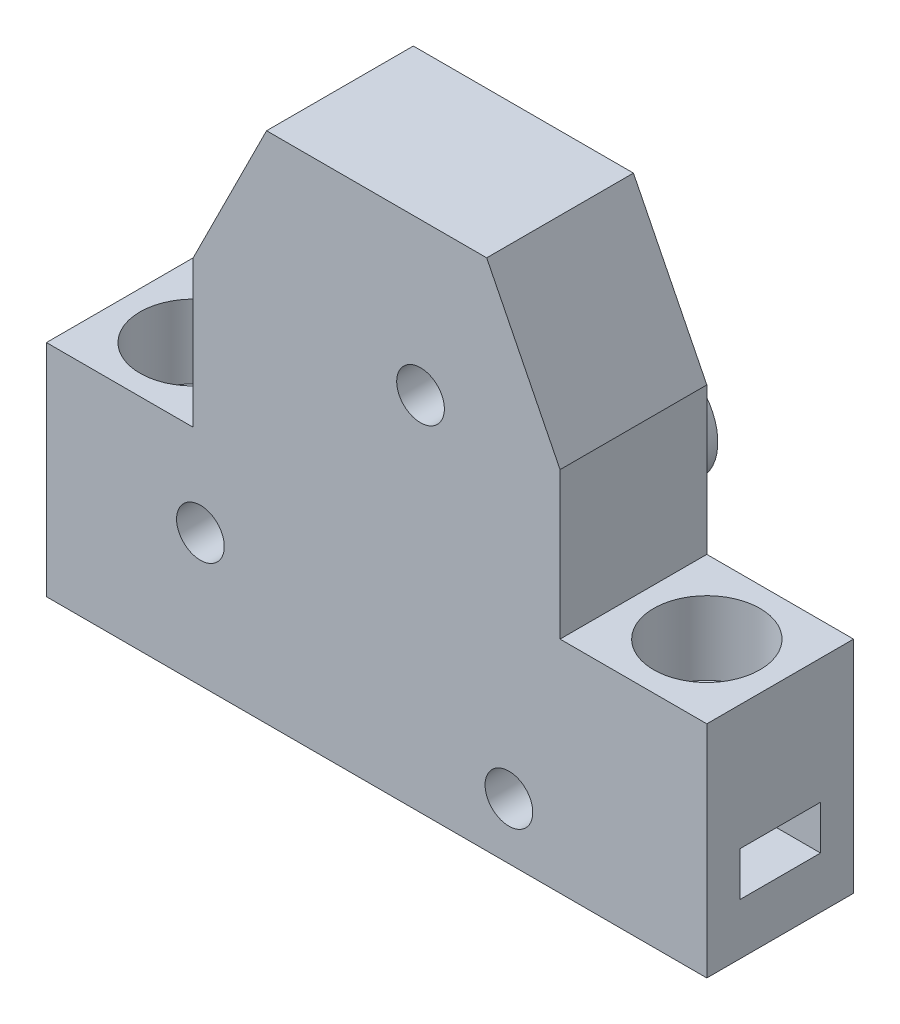
ISO-10303-21;
HEADER;
FILE_DESCRIPTION(('STEP AP214'),'2;1');
FILE_NAME('part.step','',(''),(''),'','','');
FILE_SCHEMA(('AUTOMOTIVE_DESIGN { 1 0 10303 214 1 1 1 1 }'));
ENDSEC;
DATA;
#1=APPLICATION_CONTEXT('core data for automotive mechanical design processes');
#2=APPLICATION_PROTOCOL_DEFINITION('international standard','automotive_design',2000,#1);
#3=PRODUCT_CONTEXT('',#1,'mechanical');
#4=PRODUCT('Part','Part','',(#3));
#5=PRODUCT_RELATED_PRODUCT_CATEGORY('part','',(#4));
#6=PRODUCT_DEFINITION_FORMATION('','',#4);
#7=PRODUCT_DEFINITION_CONTEXT('part definition',#1,'design');
#8=PRODUCT_DEFINITION('design','',#6,#7);
#9=PRODUCT_DEFINITION_SHAPE('','',#8);
#10=(LENGTH_UNIT() NAMED_UNIT(*) SI_UNIT(.MILLI.,.METRE.));
#11=(NAMED_UNIT(*) PLANE_ANGLE_UNIT() SI_UNIT($,.RADIAN.));
#12=(NAMED_UNIT(*) SI_UNIT($,.STERADIAN.) SOLID_ANGLE_UNIT());
#13=UNCERTAINTY_MEASURE_WITH_UNIT(LENGTH_MEASURE(1.E-05),#10,'distance_accuracy_value','');
#14=(GEOMETRIC_REPRESENTATION_CONTEXT(3) GLOBAL_UNCERTAINTY_ASSIGNED_CONTEXT((#13)) GLOBAL_UNIT_ASSIGNED_CONTEXT((#10,
#11,#12)) REPRESENTATION_CONTEXT('',''));
#15=CARTESIAN_POINT('',(0.,0.,0.));
#16=DIRECTION('',(0.,0.,1.));
#17=DIRECTION('',(1.,0.,0.));
#18=AXIS2_PLACEMENT_3D('',#15,#16,#17);
#19=CARTESIAN_POINT('',(45.0000000000002,-24.9999999999998,10.));
#20=DIRECTION('',(-1.,0.,0.));
#21=DIRECTION('',(0.,-1.,0.));
#22=AXIS2_PLACEMENT_3D('',#19,#20,#21);
#23=PLANE('',#22);
#24=DIRECTION('',(0.,1.,0.));
#25=VECTOR('',#24,1.);
#26=CARTESIAN_POINT('',(45.0000000000002,-24.9999999999998,-10.));
#27=LINE('',#26,#25);
#28=CARTESIAN_POINT('',(45.0000000000002,-24.9999999999998,-10.));
#29=VERTEX_POINT('',#28);
#30=CARTESIAN_POINT('',(45.,5.00000000000045,-10.));
#31=VERTEX_POINT('',#30);
#32=EDGE_CURVE('E295',#29,#31,#27,.T.);
#33=ORIENTED_EDGE('',*,*,#32,.T.);
#34=DIRECTION('',(0.,0.,-1.));
#35=VECTOR('',#34,1.);
#36=CARTESIAN_POINT('',(45.,5.00000000000045,10.));
#37=LINE('',#36,#35);
#38=CARTESIAN_POINT('',(45.,5.00000000000045,10.));
#39=VERTEX_POINT('',#38);
#40=EDGE_CURVE('E320',#39,#31,#37,.T.);
#41=ORIENTED_EDGE('',*,*,#40,.F.);
#42=DIRECTION('',(0.,1.,0.));
#43=VECTOR('',#42,1.);
#44=CARTESIAN_POINT('',(45.0000000000002,-24.9999999999998,10.));
#45=LINE('',#44,#43);
#46=CARTESIAN_POINT('',(45.0000000000002,-24.9999999999998,10.));
#47=VERTEX_POINT('',#46);
#48=EDGE_CURVE('E273',#47,#39,#45,.T.);
#49=ORIENTED_EDGE('',*,*,#48,.F.);
#50=DIRECTION('',(0.,0.,-1.));
#51=VECTOR('',#50,1.);
#52=CARTESIAN_POINT('',(45.0000000000002,-24.9999999999998,10.));
#53=LINE('',#52,#51);
#54=EDGE_CURVE('E323',#47,#29,#53,.T.);
#55=ORIENTED_EDGE('',*,*,#54,.T.);
#56=EDGE_LOOP('',(#33,#41,#49,#55));
#57=FACE_BOUND('',#56,.T.);
#58=DIRECTION('',(0.,-1.,0.));
#59=VECTOR('',#58,1.);
#60=CARTESIAN_POINT('',(45.,-18.,-5.5));
#61=LINE('',#60,#59);
#62=CARTESIAN_POINT('',(45.0000000000001,-12.,-5.5));
#63=VERTEX_POINT('',#62);
#64=CARTESIAN_POINT('',(45.,-18.,-5.5));
#65=VERTEX_POINT('',#64);
#66=EDGE_CURVE('E51',#63,#65,#61,.T.);
#67=ORIENTED_EDGE('',*,*,#66,.T.);
#68=DIRECTION('',(0.,0.,1.));
#69=VECTOR('',#68,1.);
#70=CARTESIAN_POINT('',(45.,-18.,5.5));
#71=LINE('',#70,#69);
#72=CARTESIAN_POINT('',(45.,-18.,5.5));
#73=VERTEX_POINT('',#72);
#74=EDGE_CURVE('E181',#65,#73,#71,.T.);
#75=ORIENTED_EDGE('',*,*,#74,.T.);
#76=DIRECTION('',(0.,1.,0.));
#77=VECTOR('',#76,1.);
#78=CARTESIAN_POINT('',(45.,-18.,5.5));
#79=LINE('',#78,#77);
#80=CARTESIAN_POINT('',(45.,-12.,5.5));
#81=VERTEX_POINT('',#80);
#82=EDGE_CURVE('E184',#73,#81,#79,.T.);
#83=ORIENTED_EDGE('',*,*,#82,.T.);
#84=DIRECTION('',(0.,0.,-1.));
#85=VECTOR('',#84,1.);
#86=CARTESIAN_POINT('',(45.,-12.,5.5));
#87=LINE('',#86,#85);
#88=EDGE_CURVE('E193',#81,#63,#87,.T.);
#89=ORIENTED_EDGE('',*,*,#88,.T.);
#90=EDGE_LOOP('',(#67,#75,#83,#89));
#91=FACE_BOUND('',#90,.T.);
#92=ADVANCED_FACE('F35',(#57,#91),#23,.F.);
#93=CARTESIAN_POINT('',(-25.,5.,10.));
#94=DIRECTION('',(1.,0.,0.));
#95=DIRECTION('',(0.,0.,-1.));
#96=AXIS2_PLACEMENT_3D('',#93,#94,#95);
#97=PLANE('',#96);
#98=DIRECTION('',(0.,-1.,0.));
#99=VECTOR('',#98,1.);
#100=CARTESIAN_POINT('',(-25.,5.,-10.));
#101=LINE('',#100,#99);
#102=CARTESIAN_POINT('',(-25.,25.,-10.));
#103=VERTEX_POINT('',#102);
#104=CARTESIAN_POINT('',(-25.,5.,-10.));
#105=VERTEX_POINT('',#104);
#106=EDGE_CURVE('E262',#103,#105,#101,.T.);
#107=ORIENTED_EDGE('',*,*,#106,.T.);
#108=DIRECTION('',(0.,0.,-1.));
#109=VECTOR('',#108,1.);
#110=CARTESIAN_POINT('',(-25.,5.,10.));
#111=LINE('',#110,#109);
#112=CARTESIAN_POINT('',(-25.,5.,10.));
#113=VERTEX_POINT('',#112);
#114=EDGE_CURVE('E332',#113,#105,#111,.T.);
#115=ORIENTED_EDGE('',*,*,#114,.F.);
#116=DIRECTION('',(0.,-1.,0.));
#117=VECTOR('',#116,1.);
#118=CARTESIAN_POINT('',(-25.,5.,10.));
#119=LINE('',#118,#117);
#120=CARTESIAN_POINT('',(-25.,25.,10.));
#121=VERTEX_POINT('',#120);
#122=EDGE_CURVE('E263',#121,#113,#119,.T.);
#123=ORIENTED_EDGE('',*,*,#122,.F.);
#124=DIRECTION('',(0.,0.,-1.));
#125=VECTOR('',#124,1.);
#126=CARTESIAN_POINT('',(-25.,25.,10.));
#127=LINE('',#126,#125);
#128=EDGE_CURVE('E285',#121,#103,#127,.T.);
#129=ORIENTED_EDGE('',*,*,#128,.T.);
#130=EDGE_LOOP('',(#107,#115,#123,#129));
#131=FACE_BOUND('',#130,.T.);
#132=ADVANCED_FACE('F360',(#131),#97,.F.);
#133=CARTESIAN_POINT('',(-25.,5.,10.));
#134=DIRECTION('',(0.,-1.,0.));
#135=DIRECTION('',(1.,0.,0.));
#136=AXIS2_PLACEMENT_3D('',#133,#134,#135);
#137=PLANE('',#136);
#138=CARTESIAN_POINT('',(-35.,5.,0.));
#139=DIRECTION('',(0.,1.,0.));
#140=DIRECTION('',(-1.,0.,0.));
#141=AXIS2_PLACEMENT_3D('',#138,#139,#140);
#142=CIRCLE('',#141,7.25);
#143=CARTESIAN_POINT('',(-42.25,5.,0.));
#144=VERTEX_POINT('',#143);
#145=EDGE_CURVE('E239',#144,#144,#142,.T.);
#146=ORIENTED_EDGE('',*,*,#145,.F.);
#147=EDGE_LOOP('',(#146));
#148=FACE_BOUND('',#147,.T.);
#149=DIRECTION('',(-1.,0.,0.));
#150=VECTOR('',#149,1.);
#151=CARTESIAN_POINT('',(-25.,5.,-10.));
#152=LINE('',#151,#150);
#153=CARTESIAN_POINT('',(-45.,5.,-10.));
#154=VERTEX_POINT('',#153);
#155=EDGE_CURVE('E288',#105,#154,#152,.T.);
#156=ORIENTED_EDGE('',*,*,#155,.T.);
#157=DIRECTION('',(0.,0.,-1.));
#158=VECTOR('',#157,1.);
#159=CARTESIAN_POINT('',(-45.,5.,10.));
#160=LINE('',#159,#158);
#161=CARTESIAN_POINT('',(-45.,5.,10.));
#162=VERTEX_POINT('',#161);
#163=EDGE_CURVE('E329',#162,#154,#160,.T.);
#164=ORIENTED_EDGE('',*,*,#163,.F.);
#165=DIRECTION('',(-1.,0.,0.));
#166=VECTOR('',#165,1.);
#167=CARTESIAN_POINT('',(-25.,5.,10.));
#168=LINE('',#167,#166);
#169=EDGE_CURVE('E266',#113,#162,#168,.T.);
#170=ORIENTED_EDGE('',*,*,#169,.F.);
#171=ORIENTED_EDGE('',*,*,#114,.T.);
#172=EDGE_LOOP('',(#156,#164,#170,#171));
#173=FACE_BOUND('',#172,.T.);
#174=ADVANCED_FACE('F366',(#148,#173),#137,.F.);
#175=CARTESIAN_POINT('',(-45.,-25.,10.));
#176=DIRECTION('',(1.,0.,0.));
#177=DIRECTION('',(0.,0.,-1.));
#178=AXIS2_PLACEMENT_3D('',#175,#176,#177);
#179=PLANE('',#178);
#180=DIRECTION('',(0.,0.,1.));
#181=VECTOR('',#180,1.);
#182=CARTESIAN_POINT('',(-45.,-18.,5.5));
#183=LINE('',#182,#181);
#184=CARTESIAN_POINT('',(-45.,-18.,-5.5));
#185=VERTEX_POINT('',#184);
#186=CARTESIAN_POINT('',(-45.,-18.,5.5));
#187=VERTEX_POINT('',#186);
#188=EDGE_CURVE('E229',#185,#187,#183,.T.);
#189=ORIENTED_EDGE('',*,*,#188,.F.);
#190=DIRECTION('',(0.,-1.,0.));
#191=VECTOR('',#190,1.);
#192=CARTESIAN_POINT('',(-45.,-18.,-5.5));
#193=LINE('',#192,#191);
#194=CARTESIAN_POINT('',(-45.,-12.,-5.5));
#195=VERTEX_POINT('',#194);
#196=EDGE_CURVE('E59',#195,#185,#193,.T.);
#197=ORIENTED_EDGE('',*,*,#196,.F.);
#198=DIRECTION('',(0.,0.,-1.));
#199=VECTOR('',#198,1.);
#200=CARTESIAN_POINT('',(-45.,-12.,5.5));
#201=LINE('',#200,#199);
#202=CARTESIAN_POINT('',(-45.,-12.,5.5));
#203=VERTEX_POINT('',#202);
#204=EDGE_CURVE('E218',#203,#195,#201,.T.);
#205=ORIENTED_EDGE('',*,*,#204,.F.);
#206=DIRECTION('',(0.,1.,0.));
#207=VECTOR('',#206,1.);
#208=CARTESIAN_POINT('',(-45.,-18.,5.5));
#209=LINE('',#208,#207);
#210=EDGE_CURVE('E232',#187,#203,#209,.T.);
#211=ORIENTED_EDGE('',*,*,#210,.F.);
#212=EDGE_LOOP('',(#189,#197,#205,#211));
#213=FACE_BOUND('',#212,.T.);
#214=DIRECTION('',(0.,-1.,0.));
#215=VECTOR('',#214,1.);
#216=CARTESIAN_POINT('',(-45.,-25.,-10.));
#217=LINE('',#216,#215);
#218=CARTESIAN_POINT('',(-45.,-25.,-10.));
#219=VERTEX_POINT('',#218);
#220=EDGE_CURVE('E290',#154,#219,#217,.T.);
#221=ORIENTED_EDGE('',*,*,#220,.T.);
#222=DIRECTION('',(0.,0.,-1.));
#223=VECTOR('',#222,1.);
#224=CARTESIAN_POINT('',(-45.,-25.,10.));
#225=LINE('',#224,#223);
#226=CARTESIAN_POINT('',(-45.,-25.,10.));
#227=VERTEX_POINT('',#226);
#228=EDGE_CURVE('E326',#227,#219,#225,.T.);
#229=ORIENTED_EDGE('',*,*,#228,.F.);
#230=DIRECTION('',(0.,-1.,0.));
#231=VECTOR('',#230,1.);
#232=CARTESIAN_POINT('',(-45.,-25.,10.));
#233=LINE('',#232,#231);
#234=EDGE_CURVE('E269',#162,#227,#233,.T.);
#235=ORIENTED_EDGE('',*,*,#234,.F.);
#236=ORIENTED_EDGE('',*,*,#163,.T.);
#237=EDGE_LOOP('',(#221,#229,#235,#236));
#238=FACE_BOUND('',#237,.T.);
#239=ADVANCED_FACE('F376',(#213,#238),#179,.F.);
#240=CARTESIAN_POINT('',(25.,-25.,10.));
#241=DIRECTION('',(0.,1.,0.));
#242=DIRECTION('',(-1.,0.,0.));
#243=AXIS2_PLACEMENT_3D('',#240,#241,#242);
#244=PLANE('',#243);
#245=DIRECTION('',(1.,0.,0.));
#246=VECTOR('',#245,1.);
#247=CARTESIAN_POINT('',(25.,-25.,-10.));
#248=LINE('',#247,#246);
#249=EDGE_CURVE('E293',#219,#29,#248,.T.);
#250=ORIENTED_EDGE('',*,*,#249,.T.);
#251=ORIENTED_EDGE('',*,*,#54,.F.);
#252=DIRECTION('',(1.,0.,0.));
#253=VECTOR('',#252,1.);
#254=CARTESIAN_POINT('',(-25.,-25.,10.));
#255=LINE('',#254,#253);
#256=EDGE_CURVE('E271',#227,#47,#255,.T.);
#257=ORIENTED_EDGE('',*,*,#256,.F.);
#258=ORIENTED_EDGE('',*,*,#228,.T.);
#259=EDGE_LOOP('',(#250,#251,#257,#258));
#260=FACE_BOUND('',#259,.T.);
#261=ADVANCED_FACE('F373',(#260),#244,.F.);
#262=CARTESIAN_POINT('',(25.,5.,10.));
#263=DIRECTION('',(0.,-1.,0.));
#264=DIRECTION('',(1.,0.,0.));
#265=AXIS2_PLACEMENT_3D('',#262,#263,#264);
#266=PLANE('',#265);
#267=CARTESIAN_POINT('',(35.,5.,0.));
#268=DIRECTION('',(0.,-1.,0.));
#269=DIRECTION('',(1.,0.,0.));
#270=AXIS2_PLACEMENT_3D('',#267,#268,#269);
#271=CIRCLE('',#270,7.25);
#272=CARTESIAN_POINT('',(42.25,5.,0.));
#273=VERTEX_POINT('',#272);
#274=EDGE_CURVE('E199',#273,#273,#271,.T.);
#275=ORIENTED_EDGE('',*,*,#274,.T.);
#276=EDGE_LOOP('',(#275));
#277=FACE_BOUND('',#276,.T.);
#278=DIRECTION('',(-1.,0.,0.));
#279=VECTOR('',#278,1.);
#280=CARTESIAN_POINT('',(25.,5.,-10.));
#281=LINE('',#280,#279);
#282=CARTESIAN_POINT('',(25.,5.,-10.));
#283=VERTEX_POINT('',#282);
#284=EDGE_CURVE('E297',#31,#283,#281,.T.);
#285=ORIENTED_EDGE('',*,*,#284,.T.);
#286=DIRECTION('',(0.,0.,-1.));
#287=VECTOR('',#286,1.);
#288=CARTESIAN_POINT('',(25.,5.,10.));
#289=LINE('',#288,#287);
#290=CARTESIAN_POINT('',(25.,5.,10.));
#291=VERTEX_POINT('',#290);
#292=EDGE_CURVE('E317',#291,#283,#289,.T.);
#293=ORIENTED_EDGE('',*,*,#292,.F.);
#294=DIRECTION('',(-1.,0.,0.));
#295=VECTOR('',#294,1.);
#296=CARTESIAN_POINT('',(25.,5.,10.));
#297=LINE('',#296,#295);
#298=EDGE_CURVE('E275',#39,#291,#297,.T.);
#299=ORIENTED_EDGE('',*,*,#298,.F.);
#300=ORIENTED_EDGE('',*,*,#40,.T.);
#301=EDGE_LOOP('',(#285,#293,#299,#300));
#302=FACE_BOUND('',#301,.T.);
#303=ADVANCED_FACE('F371',(#277,#302),#266,.F.);
#304=CARTESIAN_POINT('',(25.,5.,10.));
#305=DIRECTION('',(-1.,0.,0.));
#306=DIRECTION('',(0.,-1.,0.));
#307=AXIS2_PLACEMENT_3D('',#304,#305,#306);
#308=PLANE('',#307);
#309=DIRECTION('',(0.,1.,0.));
#310=VECTOR('',#309,1.);
#311=CARTESIAN_POINT('',(25.,5.,-10.));
#312=LINE('',#311,#310);
#313=CARTESIAN_POINT('',(25.,25.,-10.));
#314=VERTEX_POINT('',#313);
#315=EDGE_CURVE('E299',#283,#314,#312,.T.);
#316=ORIENTED_EDGE('',*,*,#315,.T.);
#317=DIRECTION('',(0.,0.,-1.));
#318=VECTOR('',#317,1.);
#319=CARTESIAN_POINT('',(25.,25.,10.));
#320=LINE('',#319,#318);
#321=CARTESIAN_POINT('',(25.,25.,10.));
#322=VERTEX_POINT('',#321);
#323=EDGE_CURVE('E314',#322,#314,#320,.T.);
#324=ORIENTED_EDGE('',*,*,#323,.F.);
#325=DIRECTION('',(0.,1.,0.));
#326=VECTOR('',#325,1.);
#327=CARTESIAN_POINT('',(25.,5.,10.));
#328=LINE('',#327,#326);
#329=EDGE_CURVE('E277',#291,#322,#328,.T.);
#330=ORIENTED_EDGE('',*,*,#329,.F.);
#331=ORIENTED_EDGE('',*,*,#292,.T.);
#332=EDGE_LOOP('',(#316,#324,#330,#331));
#333=FACE_BOUND('',#332,.T.);
#334=ADVANCED_FACE('F425',(#333),#308,.F.);
#335=CARTESIAN_POINT('',(15.,45.,10.));
#336=DIRECTION('',(-0.894427190999916,-0.447213595499958,0.));
#337=DIRECTION('',(0.447213595499958,-0.894427190999916,0.));
#338=AXIS2_PLACEMENT_3D('',#335,#336,#337);
#339=PLANE('',#338);
#340=DIRECTION('',(-0.447213595499958,0.894427190999916,0.));
#341=VECTOR('',#340,1.);
#342=CARTESIAN_POINT('',(15.,45.,-10.));
#343=LINE('',#342,#341);
#344=CARTESIAN_POINT('',(15.,45.,-10.));
#345=VERTEX_POINT('',#344);
#346=EDGE_CURVE('E301',#314,#345,#343,.T.);
#347=ORIENTED_EDGE('',*,*,#346,.T.);
#348=DIRECTION('',(0.,0.,-1.));
#349=VECTOR('',#348,1.);
#350=CARTESIAN_POINT('',(15.,45.,10.));
#351=LINE('',#350,#349);
#352=CARTESIAN_POINT('',(15.,45.,10.));
#353=VERTEX_POINT('',#352);
#354=EDGE_CURVE('E311',#353,#345,#351,.T.);
#355=ORIENTED_EDGE('',*,*,#354,.F.);
#356=DIRECTION('',(-0.447213595499958,0.894427190999916,0.));
#357=VECTOR('',#356,1.);
#358=CARTESIAN_POINT('',(15.,45.,10.));
#359=LINE('',#358,#357);
#360=EDGE_CURVE('E279',#322,#353,#359,.T.);
#361=ORIENTED_EDGE('',*,*,#360,.F.);
#362=ORIENTED_EDGE('',*,*,#323,.T.);
#363=EDGE_LOOP('',(#347,#355,#361,#362));
#364=FACE_BOUND('',#363,.T.);
#365=ADVANCED_FACE('F421',(#364),#339,.F.);
#366=CARTESIAN_POINT('',(-15.,45.,10.));
#367=DIRECTION('',(0.,-1.,0.));
#368=DIRECTION('',(0.,0.,-1.));
#369=AXIS2_PLACEMENT_3D('',#366,#367,#368);
#370=PLANE('',#369);
#371=DIRECTION('',(-1.,0.,0.));
#372=VECTOR('',#371,1.);
#373=CARTESIAN_POINT('',(-15.,45.,-10.));
#374=LINE('',#373,#372);
#375=CARTESIAN_POINT('',(-15.,45.,-10.));
#376=VERTEX_POINT('',#375);
#377=EDGE_CURVE('E303',#345,#376,#374,.T.);
#378=ORIENTED_EDGE('',*,*,#377,.T.);
#379=DIRECTION('',(0.,0.,-1.));
#380=VECTOR('',#379,1.);
#381=CARTESIAN_POINT('',(-15.,45.,10.));
#382=LINE('',#381,#380);
#383=CARTESIAN_POINT('',(-15.,45.,10.));
#384=VERTEX_POINT('',#383);
#385=EDGE_CURVE('E308',#384,#376,#382,.T.);
#386=ORIENTED_EDGE('',*,*,#385,.F.);
#387=DIRECTION('',(-1.,0.,0.));
#388=VECTOR('',#387,1.);
#389=CARTESIAN_POINT('',(-15.,45.,10.));
#390=LINE('',#389,#388);
#391=EDGE_CURVE('E281',#353,#384,#390,.T.);
#392=ORIENTED_EDGE('',*,*,#391,.F.);
#393=ORIENTED_EDGE('',*,*,#354,.T.);
#394=EDGE_LOOP('',(#378,#386,#392,#393));
#395=FACE_BOUND('',#394,.T.);
#396=ADVANCED_FACE('F417',(#395),#370,.F.);
#397=CARTESIAN_POINT('',(-25.,25.,10.));
#398=DIRECTION('',(0.894427190999916,-0.447213595499958,0.));
#399=DIRECTION('',(0.447213595499958,0.894427190999916,0.));
#400=AXIS2_PLACEMENT_3D('',#397,#398,#399);
#401=PLANE('',#400);
#402=DIRECTION('',(-0.447213595499958,-0.894427190999916,0.));
#403=VECTOR('',#402,1.);
#404=CARTESIAN_POINT('',(-25.,25.,-10.));
#405=LINE('',#404,#403);
#406=EDGE_CURVE('E267',#376,#103,#405,.T.);
#407=ORIENTED_EDGE('',*,*,#406,.T.);
#408=ORIENTED_EDGE('',*,*,#128,.F.);
#409=DIRECTION('',(-0.447213595499958,-0.894427190999916,0.));
#410=VECTOR('',#409,1.);
#411=CARTESIAN_POINT('',(-25.,25.,10.));
#412=LINE('',#411,#410);
#413=EDGE_CURVE('E283',#384,#121,#412,.T.);
#414=ORIENTED_EDGE('',*,*,#413,.F.);
#415=ORIENTED_EDGE('',*,*,#385,.T.);
#416=EDGE_LOOP('',(#407,#408,#414,#415));
#417=FACE_BOUND('',#416,.T.);
#418=ADVANCED_FACE('F413',(#417),#401,.F.);
#419=CARTESIAN_POINT('',(0.,0.,10.));
#420=DIRECTION('',(0.,0.,-1.));
#421=DIRECTION('',(-1.,0.,0.));
#422=AXIS2_PLACEMENT_3D('',#419,#420,#421);
#423=PLANE('',#422);
#424=CARTESIAN_POINT('',(5.98239087996583,24.2736688483489,10.));
#425=DIRECTION('',(0.,0.,-1.));
#426=DIRECTION('',(-1.,0.,0.));
#427=AXIS2_PLACEMENT_3D('',#424,#425,#426);
#428=CIRCLE('',#427,3.25);
#429=CARTESIAN_POINT('',(2.73239087996583,24.2736688483489,10.));
#430=VERTEX_POINT('',#429);
#431=EDGE_CURVE('E697',#430,#430,#428,.T.);
#432=ORIENTED_EDGE('',*,*,#431,.T.);
#433=EDGE_LOOP('',(#432));
#434=FACE_BOUND('',#433,.T.);
#435=CARTESIAN_POINT('',(-24.012809305704,-6.95593194675573,10.));
#436=DIRECTION('',(0.,0.,-1.));
#437=DIRECTION('',(-1.,0.,0.));
#438=AXIS2_PLACEMENT_3D('',#435,#436,#437);
#439=CIRCLE('',#438,3.25);
#440=CARTESIAN_POINT('',(-27.262809305704,-6.95593194675573,10.));
#441=VERTEX_POINT('',#440);
#442=EDGE_CURVE('E701',#441,#441,#439,.T.);
#443=ORIENTED_EDGE('',*,*,#442,.T.);
#444=EDGE_LOOP('',(#443));
#445=FACE_BOUND('',#444,.T.);
#446=CARTESIAN_POINT('',(18.0304184257382,-17.3177369015932,10.));
#447=DIRECTION('',(0.,0.,-1.));
#448=DIRECTION('',(-1.,0.,0.));
#449=AXIS2_PLACEMENT_3D('',#446,#447,#448);
#450=CIRCLE('',#449,3.25);
#451=CARTESIAN_POINT('',(14.7804184257382,-17.3177369015932,10.));
#452=VERTEX_POINT('',#451);
#453=EDGE_CURVE('E710',#452,#452,#450,.T.);
#454=ORIENTED_EDGE('',*,*,#453,.T.);
#455=EDGE_LOOP('',(#454));
#456=FACE_BOUND('',#455,.T.);
#457=ORIENTED_EDGE('',*,*,#122,.T.);
#458=ORIENTED_EDGE('',*,*,#169,.T.);
#459=ORIENTED_EDGE('',*,*,#234,.T.);
#460=ORIENTED_EDGE('',*,*,#256,.T.);
#461=ORIENTED_EDGE('',*,*,#48,.T.);
#462=ORIENTED_EDGE('',*,*,#298,.T.);
#463=ORIENTED_EDGE('',*,*,#329,.T.);
#464=ORIENTED_EDGE('',*,*,#360,.T.);
#465=ORIENTED_EDGE('',*,*,#391,.T.);
#466=ORIENTED_EDGE('',*,*,#413,.T.);
#467=EDGE_LOOP('',(#457,#458,#459,#460,#461,#462,#463,#464,#465,#466));
#468=FACE_BOUND('',#467,.T.);
#469=ADVANCED_FACE('F404',(#434,#445,#456,#468),#423,.F.);
#470=CARTESIAN_POINT('',(0.,0.,-10.));
#471=DIRECTION('',(0.,0.,-1.));
#472=DIRECTION('',(-1.,0.,0.));
#473=AXIS2_PLACEMENT_3D('',#470,#471,#472);
#474=PLANE('',#473);
#475=CARTESIAN_POINT('',(5.98239087996583,24.2736688483489,-10.));
#476=DIRECTION('',(0.,0.,-1.));
#477=DIRECTION('',(-1.,0.,0.));
#478=AXIS2_PLACEMENT_3D('',#475,#476,#477);
#479=CIRCLE('',#478,3.25);
#480=CARTESIAN_POINT('',(2.73239087996583,24.2736688483489,-10.));
#481=VERTEX_POINT('',#480);
#482=EDGE_CURVE('E700',#481,#481,#479,.T.);
#483=ORIENTED_EDGE('',*,*,#482,.F.);
#484=EDGE_LOOP('',(#483));
#485=FACE_BOUND('',#484,.T.);
#486=CARTESIAN_POINT('',(-24.012809305704,-6.95593194675573,-10.));
#487=DIRECTION('',(0.,0.,-1.));
#488=DIRECTION('',(-1.,0.,0.));
#489=AXIS2_PLACEMENT_3D('',#486,#487,#488);
#490=CIRCLE('',#489,3.25);
#491=CARTESIAN_POINT('',(-27.262809305704,-6.95593194675573,-10.));
#492=VERTEX_POINT('',#491);
#493=EDGE_CURVE('E705',#492,#492,#490,.T.);
#494=ORIENTED_EDGE('',*,*,#493,.F.);
#495=EDGE_LOOP('',(#494));
#496=FACE_BOUND('',#495,.T.);
#497=CARTESIAN_POINT('',(18.0304184257382,-17.3177369015932,-10.));
#498=DIRECTION('',(0.,0.,-1.));
#499=DIRECTION('',(-1.,0.,0.));
#500=AXIS2_PLACEMENT_3D('',#497,#498,#499);
#501=CIRCLE('',#500,3.25);
#502=CARTESIAN_POINT('',(14.7804184257382,-17.3177369015932,-10.));
#503=VERTEX_POINT('',#502);
#504=EDGE_CURVE('E712',#503,#503,#501,.T.);
#505=ORIENTED_EDGE('',*,*,#504,.F.);
#506=EDGE_LOOP('',(#505));
#507=FACE_BOUND('',#506,.T.);
#508=CARTESIAN_POINT('',(0.,0.,-10.));
#509=DIRECTION('',(0.,0.,-1.));
#510=DIRECTION('',(-1.,0.,0.));
#511=AXIS2_PLACEMENT_3D('',#508,#509,#510);
#512=CIRCLE('',#511,13.5);
#513=CARTESIAN_POINT('',(-13.5,0.,-10.));
#514=VERTEX_POINT('',#513);
#515=EDGE_CURVE('E11',#514,#514,#512,.F.);
#516=ORIENTED_EDGE('',*,*,#515,.T.);
#517=EDGE_LOOP('',(#516));
#518=FACE_BOUND('',#517,.T.);
#519=ORIENTED_EDGE('',*,*,#106,.F.);
#520=ORIENTED_EDGE('',*,*,#406,.F.);
#521=ORIENTED_EDGE('',*,*,#377,.F.);
#522=ORIENTED_EDGE('',*,*,#346,.F.);
#523=ORIENTED_EDGE('',*,*,#315,.F.);
#524=ORIENTED_EDGE('',*,*,#284,.F.);
#525=ORIENTED_EDGE('',*,*,#32,.F.);
#526=ORIENTED_EDGE('',*,*,#249,.F.);
#527=ORIENTED_EDGE('',*,*,#220,.F.);
#528=ORIENTED_EDGE('',*,*,#155,.F.);
#529=EDGE_LOOP('',(#519,#520,#521,#522,#523,#524,#525,#526,#527,#528));
#530=FACE_BOUND('',#529,.T.);
#531=ADVANCED_FACE('F395',(#485,#496,#507,#518,#530),#474,.T.);
#532=CARTESIAN_POINT('',(0.,0.,-25.));
#533=DIRECTION('',(0.,0.,1.));
#534=DIRECTION('',(1.,0.,0.));
#535=AXIS2_PLACEMENT_3D('',#532,#533,#534);
#536=CYLINDRICAL_SURFACE('',#535,7.5);
#537=CARTESIAN_POINT('',(0.,0.,-16.));
#538=DIRECTION('',(0.,0.,-1.));
#539=DIRECTION('',(-1.,0.,0.));
#540=AXIS2_PLACEMENT_3D('',#537,#538,#539);
#541=CIRCLE('',#540,7.5);
#542=CARTESIAN_POINT('',(-7.5,0.,-16.));
#543=VERTEX_POINT('',#542);
#544=EDGE_CURVE('E44',#543,#543,#541,.T.);
#545=ORIENTED_EDGE('',*,*,#544,.T.);
#546=EDGE_LOOP('',(#545));
#547=FACE_BOUND('',#546,.T.);
#548=CARTESIAN_POINT('',(0.,0.,-29.));
#549=DIRECTION('',(0.,0.,-1.));
#550=DIRECTION('',(-1.,0.,0.));
#551=AXIS2_PLACEMENT_3D('',#548,#549,#550);
#552=CIRCLE('',#551,7.5);
#553=CARTESIAN_POINT('',(-7.5,0.,-29.));
#554=VERTEX_POINT('',#553);
#555=EDGE_CURVE('E259',#554,#554,#552,.T.);
#556=ORIENTED_EDGE('',*,*,#555,.F.);
#557=EDGE_LOOP('',(#556));
#558=FACE_BOUND('',#557,.T.);
#559=ADVANCED_FACE('F341',(#547,#558),#536,.T.);
#560=CARTESIAN_POINT('',(0.,0.,-29.));
#561=DIRECTION('',(0.,0.,-1.));
#562=DIRECTION('',(-1.,0.,0.));
#563=AXIS2_PLACEMENT_3D('',#560,#561,#562);
#564=PLANE('',#563);
#565=ORIENTED_EDGE('',*,*,#555,.T.);
#566=EDGE_LOOP('',(#565));
#567=FACE_BOUND('',#566,.T.);
#568=CARTESIAN_POINT('',(0.,0.,-29.));
#569=DIRECTION('',(0.,0.,-1.));
#570=DIRECTION('',(-1.,0.,0.));
#571=AXIS2_PLACEMENT_3D('',#568,#569,#570);
#572=CIRCLE('',#571,4.7);
#573=CARTESIAN_POINT('',(-4.7,0.,-29.));
#574=VERTEX_POINT('',#573);
#575=EDGE_CURVE('E254',#574,#574,#572,.T.);
#576=ORIENTED_EDGE('',*,*,#575,.F.);
#577=EDGE_LOOP('',(#576));
#578=FACE_BOUND('',#577,.T.);
#579=ADVANCED_FACE('F480',(#567,#578),#564,.T.);
#580=CARTESIAN_POINT('',(0.,0.,-29.));
#581=DIRECTION('',(0.,0.,1.));
#582=DIRECTION('',(1.,0.,0.));
#583=AXIS2_PLACEMENT_3D('',#580,#581,#582);
#584=CYLINDRICAL_SURFACE('',#583,4.7);
#585=ORIENTED_EDGE('',*,*,#575,.T.);
#586=EDGE_LOOP('',(#585));
#587=FACE_BOUND('',#586,.T.);
#588=CARTESIAN_POINT('',(0.,0.,-25.));
#589=DIRECTION('',(0.,0.,-1.));
#590=DIRECTION('',(-1.,0.,0.));
#591=AXIS2_PLACEMENT_3D('',#588,#589,#590);
#592=CIRCLE('',#591,4.7);
#593=CARTESIAN_POINT('',(-4.7,0.,-25.));
#594=VERTEX_POINT('',#593);
#595=EDGE_CURVE('E335',#594,#594,#592,.F.);
#596=ORIENTED_EDGE('',*,*,#595,.T.);
#597=EDGE_LOOP('',(#596));
#598=FACE_BOUND('',#597,.T.);
#599=ADVANCED_FACE('F477',(#587,#598),#584,.F.);
#600=CARTESIAN_POINT('',(0.,0.,-25.));
#601=DIRECTION('',(0.,0.,-1.));
#602=DIRECTION('',(-1.,0.,0.));
#603=AXIS2_PLACEMENT_3D('',#600,#601,#602);
#604=PLANE('',#603);
#605=CARTESIAN_POINT('',(0.,0.,-25.));
#606=DIRECTION('',(0.,0.,-1.));
#607=DIRECTION('',(-1.,0.,0.));
#608=AXIS2_PLACEMENT_3D('',#605,#606,#607);
#609=CIRCLE('',#608,2.);
#610=CARTESIAN_POINT('',(-2.,0.,-25.));
#611=VERTEX_POINT('',#610);
#612=EDGE_CURVE('E248',#611,#611,#609,.T.);
#613=ORIENTED_EDGE('',*,*,#612,.F.);
#614=EDGE_LOOP('',(#613));
#615=FACE_BOUND('',#614,.T.);
#616=ORIENTED_EDGE('',*,*,#595,.F.);
#617=EDGE_LOOP('',(#616));
#618=FACE_BOUND('',#617,.T.);
#619=ADVANCED_FACE('F475',(#615,#618),#604,.T.);
#620=CARTESIAN_POINT('',(0.,0.,-22.));
#621=DIRECTION('',(0.,0.,-1.));
#622=DIRECTION('',(-1.,0.,0.));
#623=AXIS2_PLACEMENT_3D('',#620,#621,#622);
#624=CYLINDRICAL_SURFACE('',#623,2.);
#625=CARTESIAN_POINT('',(0.,0.,-22.));
#626=DIRECTION('',(0.,0.,-1.));
#627=DIRECTION('',(-1.,0.,0.));
#628=AXIS2_PLACEMENT_3D('',#625,#626,#627);
#629=CIRCLE('',#628,2.);
#630=CARTESIAN_POINT('',(-2.,0.,-22.));
#631=VERTEX_POINT('',#630);
#632=EDGE_CURVE('E251',#631,#631,#629,.T.);
#633=ORIENTED_EDGE('',*,*,#632,.F.);
#634=EDGE_LOOP('',(#633));
#635=FACE_BOUND('',#634,.T.);
#636=ORIENTED_EDGE('',*,*,#612,.T.);
#637=EDGE_LOOP('',(#636));
#638=FACE_BOUND('',#637,.T.);
#639=ADVANCED_FACE('F355',(#635,#638),#624,.F.);
#640=CARTESIAN_POINT('',(0.,0.,-22.));
#641=DIRECTION('',(0.,0.,-1.));
#642=DIRECTION('',(-1.,0.,0.));
#643=AXIS2_PLACEMENT_3D('',#640,#641,#642);
#644=PLANE('',#643);
#645=ORIENTED_EDGE('',*,*,#632,.T.);
#646=EDGE_LOOP('',(#645));
#647=FACE_BOUND('',#646,.T.);
#648=ADVANCED_FACE('F346',(#647),#644,.T.);
#649=CARTESIAN_POINT('',(0.,0.,-16.));
#650=DIRECTION('',(0.,0.,-1.));
#651=DIRECTION('',(-1.,0.,0.));
#652=AXIS2_PLACEMENT_3D('',#649,#650,#651);
#653=TOROIDAL_SURFACE('',#652,13.5,6.);
#654=ORIENTED_EDGE('',*,*,#515,.F.);
#655=EDGE_LOOP('',(#654));
#656=FACE_BOUND('',#655,.T.);
#657=ORIENTED_EDGE('',*,*,#544,.F.);
#658=EDGE_LOOP('',(#657));
#659=FACE_BOUND('',#658,.T.);
#660=ADVANCED_FACE('F37',(#656,#659),#653,.F.);
#661=CARTESIAN_POINT('',(-35.,-5.,0.));
#662=DIRECTION('',(0.,1.,0.));
#663=DIRECTION('',(-1.,0.,0.));
#664=AXIS2_PLACEMENT_3D('',#661,#662,#663);
#665=CYLINDRICAL_SURFACE('',#664,7.25);
#666=CARTESIAN_POINT('',(-35.,-5.,0.));
#667=DIRECTION('',(0.,1.,0.));
#668=DIRECTION('',(-1.,0.,0.));
#669=AXIS2_PLACEMENT_3D('',#666,#667,#668);
#670=CIRCLE('',#669,7.25);
#671=CARTESIAN_POINT('',(-42.25,-5.,0.));
#672=VERTEX_POINT('',#671);
#673=EDGE_CURVE('E245',#672,#672,#670,.T.);
#674=ORIENTED_EDGE('',*,*,#673,.F.);
#675=EDGE_LOOP('',(#674));
#676=FACE_BOUND('',#675,.T.);
#677=ORIENTED_EDGE('',*,*,#145,.T.);
#678=EDGE_LOOP('',(#677));
#679=FACE_BOUND('',#678,.T.);
#680=ADVANCED_FACE('F345',(#676,#679),#665,.F.);
#681=CARTESIAN_POINT('',(-35.,-5.,0.));
#682=DIRECTION('',(0.,1.,0.));
#683=DIRECTION('',(-1.,0.,0.));
#684=AXIS2_PLACEMENT_3D('',#681,#682,#683);
#685=PLANE('',#684);
#686=CARTESIAN_POINT('',(-35.,-5.,0.));
#687=DIRECTION('',(0.,1.,0.));
#688=DIRECTION('',(-1.,0.,0.));
#689=AXIS2_PLACEMENT_3D('',#686,#687,#688);
#690=CIRCLE('',#689,3.25);
#691=CARTESIAN_POINT('',(-38.25,-5.,0.));
#692=VERTEX_POINT('',#691);
#693=EDGE_CURVE('E206',#692,#692,#690,.T.);
#694=ORIENTED_EDGE('',*,*,#693,.F.);
#695=EDGE_LOOP('',(#694));
#696=FACE_BOUND('',#695,.T.);
#697=ORIENTED_EDGE('',*,*,#673,.T.);
#698=EDGE_LOOP('',(#697));
#699=FACE_BOUND('',#698,.T.);
#700=ADVANCED_FACE('F352',(#696,#699),#685,.T.);
#701=CARTESIAN_POINT('',(-25.,-18.,-5.5));
#702=DIRECTION('',(0.,0.,-1.));
#703=DIRECTION('',(-1.,0.,0.));
#704=AXIS2_PLACEMENT_3D('',#701,#702,#703);
#705=PLANE('',#704);
#706=ORIENTED_EDGE('',*,*,#196,.T.);
#707=DIRECTION('',(-1.,0.,0.));
#708=VECTOR('',#707,1.);
#709=CARTESIAN_POINT('',(-25.,-18.,-5.5));
#710=LINE('',#709,#708);
#711=CARTESIAN_POINT('',(-25.,-18.,-5.5));
#712=VERTEX_POINT('',#711);
#713=EDGE_CURVE('E227',#712,#185,#710,.T.);
#714=ORIENTED_EDGE('',*,*,#713,.F.);
#715=DIRECTION('',(0.,-1.,0.));
#716=VECTOR('',#715,1.);
#717=CARTESIAN_POINT('',(-25.,-18.,-5.5));
#718=LINE('',#717,#716);
#719=CARTESIAN_POINT('',(-25.,-12.,-5.5));
#720=VERTEX_POINT('',#719);
#721=EDGE_CURVE('E214',#720,#712,#718,.T.);
#722=ORIENTED_EDGE('',*,*,#721,.F.);
#723=DIRECTION('',(-1.,0.,0.));
#724=VECTOR('',#723,1.);
#725=CARTESIAN_POINT('',(-25.,-12.,-5.5));
#726=LINE('',#725,#724);
#727=EDGE_CURVE('E237',#720,#195,#726,.T.);
#728=ORIENTED_EDGE('',*,*,#727,.T.);
#729=EDGE_LOOP('',(#706,#714,#722,#728));
#730=FACE_BOUND('',#729,.T.);
#731=ADVANCED_FACE('F460',(#730),#705,.F.);
#732=CARTESIAN_POINT('',(-25.,-12.,5.5));
#733=DIRECTION('',(0.,1.,0.));
#734=DIRECTION('',(0.,0.,1.));
#735=AXIS2_PLACEMENT_3D('',#732,#733,#734);
#736=PLANE('',#735);
#737=CARTESIAN_POINT('',(-35.,-12.,0.));
#738=DIRECTION('',(0.,1.,0.));
#739=DIRECTION('',(0.,0.,1.));
#740=AXIS2_PLACEMENT_3D('',#737,#738,#739);
#741=CIRCLE('',#740,3.25);
#742=CARTESIAN_POINT('',(-35.,-12.,3.25));
#743=VERTEX_POINT('',#742);
#744=EDGE_CURVE('E211',#743,#743,#741,.T.);
#745=ORIENTED_EDGE('',*,*,#744,.T.);
#746=EDGE_LOOP('',(#745));
#747=FACE_BOUND('',#746,.T.);
#748=ORIENTED_EDGE('',*,*,#204,.T.);
#749=ORIENTED_EDGE('',*,*,#727,.F.);
#750=DIRECTION('',(0.,0.,-1.));
#751=VECTOR('',#750,1.);
#752=CARTESIAN_POINT('',(-25.,-12.,5.5));
#753=LINE('',#752,#751);
#754=CARTESIAN_POINT('',(-25.,-12.,5.5));
#755=VERTEX_POINT('',#754);
#756=EDGE_CURVE('E224',#755,#720,#753,.T.);
#757=ORIENTED_EDGE('',*,*,#756,.F.);
#758=DIRECTION('',(-1.,0.,0.));
#759=VECTOR('',#758,1.);
#760=CARTESIAN_POINT('',(-25.,-12.,5.5));
#761=LINE('',#760,#759);
#762=EDGE_CURVE('E240',#755,#203,#761,.T.);
#763=ORIENTED_EDGE('',*,*,#762,.T.);
#764=EDGE_LOOP('',(#748,#749,#757,#763));
#765=FACE_BOUND('',#764,.T.);
#766=ADVANCED_FACE('F456',(#747,#765),#736,.F.);
#767=CARTESIAN_POINT('',(-25.,-18.,5.5));
#768=DIRECTION('',(0.,0.,1.));
#769=DIRECTION('',(1.,0.,0.));
#770=AXIS2_PLACEMENT_3D('',#767,#768,#769);
#771=PLANE('',#770);
#772=ORIENTED_EDGE('',*,*,#210,.T.);
#773=ORIENTED_EDGE('',*,*,#762,.F.);
#774=DIRECTION('',(0.,1.,0.));
#775=VECTOR('',#774,1.);
#776=CARTESIAN_POINT('',(-25.,-18.,5.5));
#777=LINE('',#776,#775);
#778=CARTESIAN_POINT('',(-25.,-18.,5.5));
#779=VERTEX_POINT('',#778);
#780=EDGE_CURVE('E221',#779,#755,#777,.T.);
#781=ORIENTED_EDGE('',*,*,#780,.F.);
#782=DIRECTION('',(-1.,0.,0.));
#783=VECTOR('',#782,1.);
#784=CARTESIAN_POINT('',(-25.,-18.,5.5));
#785=LINE('',#784,#783);
#786=EDGE_CURVE('E242',#779,#187,#785,.T.);
#787=ORIENTED_EDGE('',*,*,#786,.T.);
#788=EDGE_LOOP('',(#772,#773,#781,#787));
#789=FACE_BOUND('',#788,.T.);
#790=ADVANCED_FACE('F459',(#789),#771,.F.);
#791=CARTESIAN_POINT('',(-25.,-18.,5.5));
#792=DIRECTION('',(0.,-1.,0.));
#793=DIRECTION('',(0.,0.,-1.));
#794=AXIS2_PLACEMENT_3D('',#791,#792,#793);
#795=PLANE('',#794);
#796=ORIENTED_EDGE('',*,*,#188,.T.);
#797=ORIENTED_EDGE('',*,*,#786,.F.);
#798=DIRECTION('',(0.,0.,1.));
#799=VECTOR('',#798,1.);
#800=CARTESIAN_POINT('',(-25.,-18.,5.5));
#801=LINE('',#800,#799);
#802=EDGE_CURVE('E217',#712,#779,#801,.T.);
#803=ORIENTED_EDGE('',*,*,#802,.F.);
#804=ORIENTED_EDGE('',*,*,#713,.T.);
#805=EDGE_LOOP('',(#796,#797,#803,#804));
#806=FACE_BOUND('',#805,.T.);
#807=ADVANCED_FACE('F454',(#806),#795,.F.);
#808=CARTESIAN_POINT('',(-25.,0.,0.));
#809=DIRECTION('',(-1.,0.,0.));
#810=DIRECTION('',(0.,0.,1.));
#811=AXIS2_PLACEMENT_3D('',#808,#809,#810);
#812=PLANE('',#811);
#813=ORIENTED_EDGE('',*,*,#721,.T.);
#814=ORIENTED_EDGE('',*,*,#802,.T.);
#815=ORIENTED_EDGE('',*,*,#780,.T.);
#816=ORIENTED_EDGE('',*,*,#756,.T.);
#817=EDGE_LOOP('',(#813,#814,#815,#816));
#818=FACE_BOUND('',#817,.T.);
#819=ADVANCED_FACE('F447',(#818),#812,.T.);
#820=CARTESIAN_POINT('',(-35.,-27.1923881554251,0.));
#821=DIRECTION('',(0.,1.,0.));
#822=DIRECTION('',(-1.,0.,0.));
#823=AXIS2_PLACEMENT_3D('',#820,#821,#822);
#824=CYLINDRICAL_SURFACE('',#823,3.25);
#825=ORIENTED_EDGE('',*,*,#693,.T.);
#826=EDGE_LOOP('',(#825));
#827=FACE_BOUND('',#826,.T.);
#828=ORIENTED_EDGE('',*,*,#744,.F.);
#829=EDGE_LOOP('',(#828));
#830=FACE_BOUND('',#829,.T.);
#831=ADVANCED_FACE('F438',(#827,#830),#824,.F.);
#832=CARTESIAN_POINT('',(35.,-5.,0.));
#833=DIRECTION('',(0.,1.,0.));
#834=DIRECTION('',(-1.,0.,0.));
#835=AXIS2_PLACEMENT_3D('',#832,#833,#834);
#836=CYLINDRICAL_SURFACE('',#835,7.25);
#837=CARTESIAN_POINT('',(35.,-5.,0.));
#838=DIRECTION('',(0.,-1.,0.));
#839=DIRECTION('',(1.,0.,0.));
#840=AXIS2_PLACEMENT_3D('',#837,#838,#839);
#841=CIRCLE('',#840,7.25);
#842=CARTESIAN_POINT('',(42.25,-5.,0.));
#843=VERTEX_POINT('',#842);
#844=EDGE_CURVE('E203',#843,#843,#841,.T.);
#845=ORIENTED_EDGE('',*,*,#844,.T.);
#846=EDGE_LOOP('',(#845));
#847=FACE_BOUND('',#846,.T.);
#848=ORIENTED_EDGE('',*,*,#274,.F.);
#849=EDGE_LOOP('',(#848));
#850=FACE_BOUND('',#849,.T.);
#851=ADVANCED_FACE('F435',(#847,#850),#836,.F.);
#852=CARTESIAN_POINT('',(35.,-5.,0.));
#853=DIRECTION('',(0.,1.,0.));
#854=DIRECTION('',(1.,0.,0.));
#855=AXIS2_PLACEMENT_3D('',#852,#853,#854);
#856=PLANE('',#855);
#857=CARTESIAN_POINT('',(35.,-5.,0.));
#858=DIRECTION('',(0.,-1.,0.));
#859=DIRECTION('',(1.,0.,0.));
#860=AXIS2_PLACEMENT_3D('',#857,#858,#859);
#861=CIRCLE('',#860,3.25);
#862=CARTESIAN_POINT('',(38.25,-5.,0.));
#863=VERTEX_POINT('',#862);
#864=EDGE_CURVE('E187',#863,#863,#861,.T.);
#865=ORIENTED_EDGE('',*,*,#864,.T.);
#866=EDGE_LOOP('',(#865));
#867=FACE_BOUND('',#866,.T.);
#868=ORIENTED_EDGE('',*,*,#844,.F.);
#869=EDGE_LOOP('',(#868));
#870=FACE_BOUND('',#869,.T.);
#871=ADVANCED_FACE('F437',(#867,#870),#856,.T.);
#872=CARTESIAN_POINT('',(25.,-18.,-5.5));
#873=DIRECTION('',(0.,0.,1.));
#874=DIRECTION('',(1.,0.,0.));
#875=AXIS2_PLACEMENT_3D('',#872,#873,#874);
#876=PLANE('',#875);
#877=ORIENTED_EDGE('',*,*,#66,.F.);
#878=DIRECTION('',(1.,0.,0.));
#879=VECTOR('',#878,1.);
#880=CARTESIAN_POINT('',(25.,-12.,-5.5));
#881=LINE('',#880,#879);
#882=CARTESIAN_POINT('',(25.,-12.,-5.5));
#883=VERTEX_POINT('',#882);
#884=EDGE_CURVE('E166',#883,#63,#881,.T.);
#885=ORIENTED_EDGE('',*,*,#884,.F.);
#886=DIRECTION('',(0.,-1.,0.));
#887=VECTOR('',#886,1.);
#888=CARTESIAN_POINT('',(25.,-18.,-5.5));
#889=LINE('',#888,#887);
#890=CARTESIAN_POINT('',(25.,-18.,-5.5));
#891=VERTEX_POINT('',#890);
#892=EDGE_CURVE('E173',#883,#891,#889,.T.);
#893=ORIENTED_EDGE('',*,*,#892,.T.);
#894=DIRECTION('',(1.,0.,0.));
#895=VECTOR('',#894,1.);
#896=CARTESIAN_POINT('',(25.,-18.,-5.5));
#897=LINE('',#896,#895);
#898=EDGE_CURVE('E197',#891,#65,#897,.T.);
#899=ORIENTED_EDGE('',*,*,#898,.T.);
#900=EDGE_LOOP('',(#877,#885,#893,#899));
#901=FACE_BOUND('',#900,.T.);
#902=ADVANCED_FACE('F176',(#901),#876,.T.);
#903=CARTESIAN_POINT('',(25.,-18.,5.5));
#904=DIRECTION('',(0.,1.,0.));
#905=DIRECTION('',(0.,0.,1.));
#906=AXIS2_PLACEMENT_3D('',#903,#904,#905);
#907=PLANE('',#906);
#908=ORIENTED_EDGE('',*,*,#74,.F.);
#909=ORIENTED_EDGE('',*,*,#898,.F.);
#910=DIRECTION('',(0.,0.,1.));
#911=VECTOR('',#910,1.);
#912=CARTESIAN_POINT('',(25.,-18.,5.5));
#913=LINE('',#912,#911);
#914=CARTESIAN_POINT('',(25.,-18.,5.5));
#915=VERTEX_POINT('',#914);
#916=EDGE_CURVE('E178',#891,#915,#913,.T.);
#917=ORIENTED_EDGE('',*,*,#916,.T.);
#918=DIRECTION('',(1.,0.,0.));
#919=VECTOR('',#918,1.);
#920=CARTESIAN_POINT('',(25.,-18.,5.5));
#921=LINE('',#920,#919);
#922=EDGE_CURVE('E200',#915,#73,#921,.T.);
#923=ORIENTED_EDGE('',*,*,#922,.T.);
#924=EDGE_LOOP('',(#908,#909,#917,#923));
#925=FACE_BOUND('',#924,.T.);
#926=ADVANCED_FACE('F617',(#925),#907,.T.);
#927=CARTESIAN_POINT('',(25.,-18.,5.5));
#928=DIRECTION('',(0.,0.,-1.));
#929=DIRECTION('',(-1.,0.,0.));
#930=AXIS2_PLACEMENT_3D('',#927,#928,#929);
#931=PLANE('',#930);
#932=ORIENTED_EDGE('',*,*,#82,.F.);
#933=ORIENTED_EDGE('',*,*,#922,.F.);
#934=DIRECTION('',(0.,1.,0.));
#935=VECTOR('',#934,1.);
#936=CARTESIAN_POINT('',(25.,-18.,5.5));
#937=LINE('',#936,#935);
#938=CARTESIAN_POINT('',(25.,-12.,5.5));
#939=VERTEX_POINT('',#938);
#940=EDGE_CURVE('E172',#915,#939,#937,.T.);
#941=ORIENTED_EDGE('',*,*,#940,.T.);
#942=DIRECTION('',(1.,0.,0.));
#943=VECTOR('',#942,1.);
#944=CARTESIAN_POINT('',(25.,-12.,5.5));
#945=LINE('',#944,#943);
#946=EDGE_CURVE('E168',#939,#81,#945,.T.);
#947=ORIENTED_EDGE('',*,*,#946,.T.);
#948=EDGE_LOOP('',(#932,#933,#941,#947));
#949=FACE_BOUND('',#948,.T.);
#950=ADVANCED_FACE('F624',(#949),#931,.T.);
#951=CARTESIAN_POINT('',(25.,-12.,5.5));
#952=DIRECTION('',(0.,-1.,0.));
#953=DIRECTION('',(0.,0.,-1.));
#954=AXIS2_PLACEMENT_3D('',#951,#952,#953);
#955=PLANE('',#954);
#956=CARTESIAN_POINT('',(35.,-12.,0.));
#957=DIRECTION('',(0.,-1.,0.));
#958=DIRECTION('',(0.,0.,-1.));
#959=AXIS2_PLACEMENT_3D('',#956,#957,#958);
#960=CIRCLE('',#959,3.25);
#961=CARTESIAN_POINT('',(35.,-12.,-3.25));
#962=VERTEX_POINT('',#961);
#963=EDGE_CURVE('E39',#962,#962,#960,.F.);
#964=ORIENTED_EDGE('',*,*,#963,.T.);
#965=EDGE_LOOP('',(#964));
#966=FACE_BOUND('',#965,.T.);
#967=ORIENTED_EDGE('',*,*,#88,.F.);
#968=ORIENTED_EDGE('',*,*,#946,.F.);
#969=DIRECTION('',(0.,0.,-1.));
#970=VECTOR('',#969,1.);
#971=CARTESIAN_POINT('',(25.,-12.,5.5));
#972=LINE('',#971,#970);
#973=EDGE_CURVE('E163',#939,#883,#972,.T.);
#974=ORIENTED_EDGE('',*,*,#973,.T.);
#975=ORIENTED_EDGE('',*,*,#884,.T.);
#976=EDGE_LOOP('',(#967,#968,#974,#975));
#977=FACE_BOUND('',#976,.T.);
#978=ADVANCED_FACE('F165',(#966,#977),#955,.T.);
#979=CARTESIAN_POINT('',(25.,0.,0.));
#980=DIRECTION('',(1.,0.,0.));
#981=DIRECTION('',(0.,0.,1.));
#982=AXIS2_PLACEMENT_3D('',#979,#980,#981);
#983=PLANE('',#982);
#984=ORIENTED_EDGE('',*,*,#892,.F.);
#985=ORIENTED_EDGE('',*,*,#973,.F.);
#986=ORIENTED_EDGE('',*,*,#940,.F.);
#987=ORIENTED_EDGE('',*,*,#916,.F.);
#988=EDGE_LOOP('',(#984,#985,#986,#987));
#989=FACE_BOUND('',#988,.T.);
#990=ADVANCED_FACE('F180',(#989),#983,.T.);
#991=CARTESIAN_POINT('',(35.,-27.1923881554251,0.));
#992=DIRECTION('',(0.,1.,0.));
#993=DIRECTION('',(-1.,0.,0.));
#994=AXIS2_PLACEMENT_3D('',#991,#992,#993);
#995=CYLINDRICAL_SURFACE('',#994,3.25);
#996=ORIENTED_EDGE('',*,*,#963,.F.);
#997=EDGE_LOOP('',(#996));
#998=FACE_BOUND('',#997,.T.);
#999=ORIENTED_EDGE('',*,*,#864,.F.);
#1000=EDGE_LOOP('',(#999));
#1001=FACE_BOUND('',#1000,.T.);
#1002=ADVANCED_FACE('F649',(#998,#1001),#995,.F.);
#1003=CARTESIAN_POINT('',(18.0304184257382,-17.3177369015932,10.));
#1004=DIRECTION('',(0.,0.,-1.));
#1005=DIRECTION('',(-1.,0.,0.));
#1006=AXIS2_PLACEMENT_3D('',#1003,#1004,#1005);
#1007=CYLINDRICAL_SURFACE('',#1006,3.25);
#1008=ORIENTED_EDGE('',*,*,#453,.F.);
#1009=EDGE_LOOP('',(#1008));
#1010=FACE_BOUND('',#1009,.T.);
#1011=ORIENTED_EDGE('',*,*,#504,.T.);
#1012=EDGE_LOOP('',(#1011));
#1013=FACE_BOUND('',#1012,.T.);
#1014=ADVANCED_FACE('F656',(#1010,#1013),#1007,.F.);
#1015=CARTESIAN_POINT('',(-24.012809305704,-6.95593194675573,10.));
#1016=DIRECTION('',(0.,0.,-1.));
#1017=DIRECTION('',(-1.,0.,0.));
#1018=AXIS2_PLACEMENT_3D('',#1015,#1016,#1017);
#1019=CYLINDRICAL_SURFACE('',#1018,3.25);
#1020=ORIENTED_EDGE('',*,*,#442,.F.);
#1021=EDGE_LOOP('',(#1020));
#1022=FACE_BOUND('',#1021,.T.);
#1023=ORIENTED_EDGE('',*,*,#493,.T.);
#1024=EDGE_LOOP('',(#1023));
#1025=FACE_BOUND('',#1024,.T.);
#1026=ADVANCED_FACE('F664',(#1022,#1025),#1019,.F.);
#1027=CARTESIAN_POINT('',(5.98239087996583,24.2736688483489,10.));
#1028=DIRECTION('',(0.,0.,-1.));
#1029=DIRECTION('',(-1.,0.,0.));
#1030=AXIS2_PLACEMENT_3D('',#1027,#1028,#1029);
#1031=CYLINDRICAL_SURFACE('',#1030,3.25);
#1032=ORIENTED_EDGE('',*,*,#431,.F.);
#1033=EDGE_LOOP('',(#1032));
#1034=FACE_BOUND('',#1033,.T.);
#1035=ORIENTED_EDGE('',*,*,#482,.T.);
#1036=EDGE_LOOP('',(#1035));
#1037=FACE_BOUND('',#1036,.T.);
#1038=ADVANCED_FACE('F673',(#1034,#1037),#1031,.F.);
#1039=CLOSED_SHELL('',(#92,#132,#174,#239,#261,#303,#334,#365,#396,#418,#469,#531,#559,#579,
#599,#619,#639,#648,#660,#680,#700,#731,#766,#790,#807,#819,#831,#851,#871,#902,#926,#950,#978,
#990,#1002,#1014,#1026,#1038));
#1040=MANIFOLD_SOLID_BREP('B2',#1039);
#1041=ADVANCED_BREP_SHAPE_REPRESENTATION('',(#18,#1040),#14);
#1042=SHAPE_DEFINITION_REPRESENTATION(#9,#1041);
ENDSEC;
END-ISO-10303-21;
